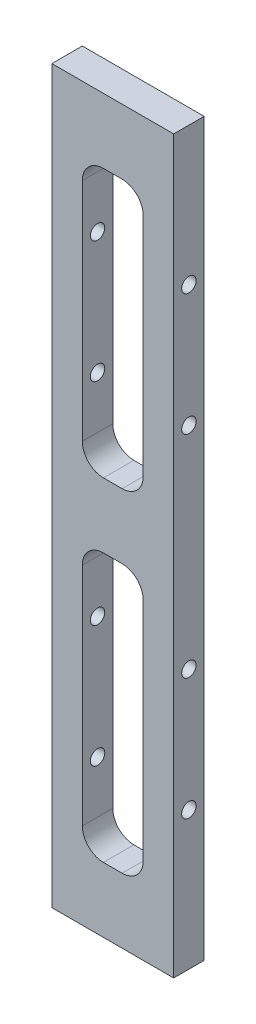
ISO-10303-21;
HEADER;
FILE_DESCRIPTION(('STEP AP214'),'2;1');
FILE_NAME('part.step','',(''),(''),'','','');
FILE_SCHEMA(('AUTOMOTIVE_DESIGN { 1 0 10303 214 1 1 1 1 }'));
ENDSEC;
DATA;
#1=APPLICATION_CONTEXT('core data for automotive mechanical design processes');
#2=APPLICATION_PROTOCOL_DEFINITION('international standard','automotive_design',2000,#1);
#3=PRODUCT_CONTEXT('',#1,'mechanical');
#4=PRODUCT('Part','Part','',(#3));
#5=PRODUCT_RELATED_PRODUCT_CATEGORY('part','',(#4));
#6=PRODUCT_DEFINITION_FORMATION('','',#4);
#7=PRODUCT_DEFINITION_CONTEXT('part definition',#1,'design');
#8=PRODUCT_DEFINITION('design','',#6,#7);
#9=PRODUCT_DEFINITION_SHAPE('','',#8);
#10=(LENGTH_UNIT() NAMED_UNIT(*) SI_UNIT(.MILLI.,.METRE.));
#11=(NAMED_UNIT(*) PLANE_ANGLE_UNIT() SI_UNIT($,.RADIAN.));
#12=(NAMED_UNIT(*) SI_UNIT($,.STERADIAN.) SOLID_ANGLE_UNIT());
#13=UNCERTAINTY_MEASURE_WITH_UNIT(LENGTH_MEASURE(1.E-05),#10,'distance_accuracy_value','');
#14=(GEOMETRIC_REPRESENTATION_CONTEXT(3) GLOBAL_UNCERTAINTY_ASSIGNED_CONTEXT((#13)) GLOBAL_UNIT_ASSIGNED_CONTEXT((#10,
#11,#12)) REPRESENTATION_CONTEXT('',''));
#15=CARTESIAN_POINT('',(0.,0.,0.));
#16=DIRECTION('',(0.,0.,1.));
#17=DIRECTION('',(1.,0.,0.));
#18=AXIS2_PLACEMENT_3D('',#15,#16,#17);
#19=CARTESIAN_POINT('',(9.525,-57.15,4.7625));
#20=DIRECTION('',(-1.,0.,0.));
#21=DIRECTION('',(0.,0.,1.));
#22=AXIS2_PLACEMENT_3D('',#19,#20,#21);
#23=PLANE('',#22);
#24=CARTESIAN_POINT('',(9.525,35.56,2.38125));
#25=DIRECTION('',(1.,0.,0.));
#26=DIRECTION('',(0.,0.,-1.));
#27=AXIS2_PLACEMENT_3D('',#24,#25,#26);
#28=CIRCLE('',#27,1.13029999999999);
#29=CARTESIAN_POINT('',(9.525,35.56,1.25095000000001));
#30=VERTEX_POINT('',#29);
#31=EDGE_CURVE('E516',#30,#30,#28,.T.);
#32=ORIENTED_EDGE('',*,*,#31,.F.);
#33=EDGE_LOOP('',(#32));
#34=FACE_BOUND('',#33,.T.);
#35=CARTESIAN_POINT('',(9.525,16.51,2.38125));
#36=DIRECTION('',(1.,0.,0.));
#37=DIRECTION('',(0.,0.,-1.));
#38=AXIS2_PLACEMENT_3D('',#35,#36,#37);
#39=CIRCLE('',#38,1.13029999999999);
#40=CARTESIAN_POINT('',(9.525,16.51,1.25095000000001));
#41=VERTEX_POINT('',#40);
#42=EDGE_CURVE('E290',#41,#41,#39,.T.);
#43=ORIENTED_EDGE('',*,*,#42,.F.);
#44=EDGE_LOOP('',(#43));
#45=FACE_BOUND('',#44,.T.);
#46=CARTESIAN_POINT('',(9.525,-16.51,2.38124999999999));
#47=DIRECTION('',(1.,0.,0.));
#48=DIRECTION('',(0.,0.,-1.));
#49=AXIS2_PLACEMENT_3D('',#46,#47,#48);
#50=CIRCLE('',#49,1.13029999999999);
#51=CARTESIAN_POINT('',(9.525,-16.51,1.25095));
#52=VERTEX_POINT('',#51);
#53=EDGE_CURVE('E287',#52,#52,#50,.T.);
#54=ORIENTED_EDGE('',*,*,#53,.F.);
#55=EDGE_LOOP('',(#54));
#56=FACE_BOUND('',#55,.T.);
#57=CARTESIAN_POINT('',(9.525,-35.56,2.38124999999999));
#58=DIRECTION('',(1.,0.,0.));
#59=DIRECTION('',(0.,0.,-1.));
#60=AXIS2_PLACEMENT_3D('',#57,#58,#59);
#61=CIRCLE('',#60,1.13029999999999);
#62=CARTESIAN_POINT('',(9.525,-35.56,1.25095));
#63=VERTEX_POINT('',#62);
#64=EDGE_CURVE('E305',#63,#63,#61,.T.);
#65=ORIENTED_EDGE('',*,*,#64,.F.);
#66=EDGE_LOOP('',(#65));
#67=FACE_BOUND('',#66,.T.);
#68=DIRECTION('',(0.,1.,0.));
#69=VECTOR('',#68,1.);
#70=CARTESIAN_POINT('',(9.525,-57.15,0.));
#71=LINE('',#70,#69);
#72=CARTESIAN_POINT('',(9.525,-57.15,0.));
#73=VERTEX_POINT('',#72);
#74=CARTESIAN_POINT('',(9.525,57.15,0.));
#75=VERTEX_POINT('',#74);
#76=EDGE_CURVE('E198',#73,#75,#71,.T.);
#77=ORIENTED_EDGE('',*,*,#76,.T.);
#78=DIRECTION('',(0.,0.,-1.));
#79=VECTOR('',#78,1.);
#80=CARTESIAN_POINT('',(9.525,57.15,4.7625));
#81=LINE('',#80,#79);
#82=CARTESIAN_POINT('',(9.525,57.15,4.7625));
#83=VERTEX_POINT('',#82);
#84=EDGE_CURVE('E179',#83,#75,#81,.T.);
#85=ORIENTED_EDGE('',*,*,#84,.F.);
#86=DIRECTION('',(0.,1.,0.));
#87=VECTOR('',#86,1.);
#88=CARTESIAN_POINT('',(9.525,-57.15,4.7625));
#89=LINE('',#88,#87);
#90=CARTESIAN_POINT('',(9.525,-57.15,4.7625));
#91=VERTEX_POINT('',#90);
#92=EDGE_CURVE('E186',#91,#83,#89,.T.);
#93=ORIENTED_EDGE('',*,*,#92,.F.);
#94=DIRECTION('',(0.,0.,-1.));
#95=VECTOR('',#94,1.);
#96=CARTESIAN_POINT('',(9.525,-57.15,4.7625));
#97=LINE('',#96,#95);
#98=EDGE_CURVE('E359',#91,#73,#97,.T.);
#99=ORIENTED_EDGE('',*,*,#98,.T.);
#100=EDGE_LOOP('',(#77,#85,#93,#99));
#101=FACE_BOUND('',#100,.T.);
#102=ADVANCED_FACE('F35',(#34,#45,#56,#67,#101),#23,.F.);
#103=CARTESIAN_POINT('',(-9.525,57.15,4.7625));
#104=DIRECTION('',(0.,-1.,0.));
#105=DIRECTION('',(0.,0.,-1.));
#106=AXIS2_PLACEMENT_3D('',#103,#104,#105);
#107=PLANE('',#106);
#108=DIRECTION('',(-1.,0.,0.));
#109=VECTOR('',#108,1.);
#110=CARTESIAN_POINT('',(-9.525,57.15,0.));
#111=LINE('',#110,#109);
#112=CARTESIAN_POINT('',(-9.525,57.15,0.));
#113=VERTEX_POINT('',#112);
#114=EDGE_CURVE('E361',#75,#113,#111,.T.);
#115=ORIENTED_EDGE('',*,*,#114,.T.);
#116=DIRECTION('',(0.,0.,-1.));
#117=VECTOR('',#116,1.);
#118=CARTESIAN_POINT('',(-9.525,57.15,4.7625));
#119=LINE('',#118,#117);
#120=CARTESIAN_POINT('',(-9.525,57.15,4.7625));
#121=VERTEX_POINT('',#120);
#122=EDGE_CURVE('E182',#121,#113,#119,.T.);
#123=ORIENTED_EDGE('',*,*,#122,.F.);
#124=DIRECTION('',(-1.,0.,0.));
#125=VECTOR('',#124,1.);
#126=CARTESIAN_POINT('',(-9.525,57.15,4.7625));
#127=LINE('',#126,#125);
#128=EDGE_CURVE('E175',#83,#121,#127,.T.);
#129=ORIENTED_EDGE('',*,*,#128,.F.);
#130=ORIENTED_EDGE('',*,*,#84,.T.);
#131=EDGE_LOOP('',(#115,#123,#129,#130));
#132=FACE_BOUND('',#131,.T.);
#133=ADVANCED_FACE('F177',(#132),#107,.F.);
#134=CARTESIAN_POINT('',(-9.525,-57.15,4.7625));
#135=DIRECTION('',(1.,0.,0.));
#136=DIRECTION('',(0.,0.,-1.));
#137=AXIS2_PLACEMENT_3D('',#134,#135,#136);
#138=PLANE('',#137);
#139=CARTESIAN_POINT('',(-9.525,35.56,2.38125));
#140=DIRECTION('',(1.,0.,0.));
#141=DIRECTION('',(0.,0.,-1.));
#142=AXIS2_PLACEMENT_3D('',#139,#140,#141);
#143=CIRCLE('',#142,1.13029999999999);
#144=CARTESIAN_POINT('',(-9.525,35.56,1.25095));
#145=VERTEX_POINT('',#144);
#146=EDGE_CURVE('E515',#145,#145,#143,.T.);
#147=ORIENTED_EDGE('',*,*,#146,.T.);
#148=EDGE_LOOP('',(#147));
#149=FACE_BOUND('',#148,.T.);
#150=CARTESIAN_POINT('',(-9.525,16.51,2.38125));
#151=DIRECTION('',(1.,0.,0.));
#152=DIRECTION('',(0.,0.,-1.));
#153=AXIS2_PLACEMENT_3D('',#150,#151,#152);
#154=CIRCLE('',#153,1.1303);
#155=CARTESIAN_POINT('',(-9.525,16.51,1.25095));
#156=VERTEX_POINT('',#155);
#157=EDGE_CURVE('E283',#156,#156,#154,.T.);
#158=ORIENTED_EDGE('',*,*,#157,.T.);
#159=EDGE_LOOP('',(#158));
#160=FACE_BOUND('',#159,.T.);
#161=CARTESIAN_POINT('',(-9.525,-16.51,2.38124999999999));
#162=DIRECTION('',(1.,0.,0.));
#163=DIRECTION('',(0.,0.,-1.));
#164=AXIS2_PLACEMENT_3D('',#161,#162,#163);
#165=CIRCLE('',#164,1.1303);
#166=CARTESIAN_POINT('',(-9.525,-16.51,1.25094999999999));
#167=VERTEX_POINT('',#166);
#168=EDGE_CURVE('E279',#167,#167,#165,.T.);
#169=ORIENTED_EDGE('',*,*,#168,.T.);
#170=EDGE_LOOP('',(#169));
#171=FACE_BOUND('',#170,.T.);
#172=CARTESIAN_POINT('',(-9.525,-35.56,2.38124999999999));
#173=DIRECTION('',(1.,0.,0.));
#174=DIRECTION('',(0.,0.,-1.));
#175=AXIS2_PLACEMENT_3D('',#172,#173,#174);
#176=CIRCLE('',#175,1.13029999999999);
#177=CARTESIAN_POINT('',(-9.525,-35.56,1.25095));
#178=VERTEX_POINT('',#177);
#179=EDGE_CURVE('E275',#178,#178,#176,.T.);
#180=ORIENTED_EDGE('',*,*,#179,.T.);
#181=EDGE_LOOP('',(#180));
#182=FACE_BOUND('',#181,.T.);
#183=DIRECTION('',(0.,-1.,0.));
#184=VECTOR('',#183,1.);
#185=CARTESIAN_POINT('',(-9.525,-57.15,0.));
#186=LINE('',#185,#184);
#187=CARTESIAN_POINT('',(-9.525,-57.15,0.));
#188=VERTEX_POINT('',#187);
#189=EDGE_CURVE('E363',#113,#188,#186,.T.);
#190=ORIENTED_EDGE('',*,*,#189,.T.);
#191=DIRECTION('',(0.,0.,-1.));
#192=VECTOR('',#191,1.);
#193=CARTESIAN_POINT('',(-9.525,-57.15,4.7625));
#194=LINE('',#193,#192);
#195=CARTESIAN_POINT('',(-9.525,-57.15,4.7625));
#196=VERTEX_POINT('',#195);
#197=EDGE_CURVE('E203',#196,#188,#194,.T.);
#198=ORIENTED_EDGE('',*,*,#197,.F.);
#199=DIRECTION('',(0.,-1.,0.));
#200=VECTOR('',#199,1.);
#201=CARTESIAN_POINT('',(-9.525,-57.15,4.7625));
#202=LINE('',#201,#200);
#203=EDGE_CURVE('E185',#121,#196,#202,.T.);
#204=ORIENTED_EDGE('',*,*,#203,.F.);
#205=ORIENTED_EDGE('',*,*,#122,.T.);
#206=EDGE_LOOP('',(#190,#198,#204,#205));
#207=FACE_BOUND('',#206,.T.);
#208=ADVANCED_FACE('F375',(#149,#160,#171,#182,#207),#138,.F.);
#209=CARTESIAN_POINT('',(-9.525,-57.15,4.7625));
#210=DIRECTION('',(0.,1.,0.));
#211=DIRECTION('',(0.,0.,1.));
#212=AXIS2_PLACEMENT_3D('',#209,#210,#211);
#213=PLANE('',#212);
#214=DIRECTION('',(1.,0.,0.));
#215=VECTOR('',#214,1.);
#216=CARTESIAN_POINT('',(-9.525,-57.15,0.));
#217=LINE('',#216,#215);
#218=EDGE_CURVE('E195',#188,#73,#217,.T.);
#219=ORIENTED_EDGE('',*,*,#218,.T.);
#220=ORIENTED_EDGE('',*,*,#98,.F.);
#221=DIRECTION('',(1.,0.,0.));
#222=VECTOR('',#221,1.);
#223=CARTESIAN_POINT('',(-9.525,-57.15,4.7625));
#224=LINE('',#223,#222);
#225=EDGE_CURVE('E191',#196,#91,#224,.T.);
#226=ORIENTED_EDGE('',*,*,#225,.F.);
#227=ORIENTED_EDGE('',*,*,#197,.T.);
#228=EDGE_LOOP('',(#219,#220,#226,#227));
#229=FACE_BOUND('',#228,.T.);
#230=ADVANCED_FACE('F370',(#229),#213,.F.);
#231=CARTESIAN_POINT('',(0.,0.,4.7625));
#232=DIRECTION('',(0.,0.,-1.));
#233=DIRECTION('',(-1.,0.,0.));
#234=AXIS2_PLACEMENT_3D('',#231,#232,#233);
#235=PLANE('',#234);
#236=DIRECTION('',(1.,0.,0.));
#237=VECTOR('',#236,1.);
#238=CARTESIAN_POINT('',(-4.7625,-46.99,4.7625));
#239=LINE('',#238,#237);
#240=CARTESIAN_POINT('',(-1.4605,-46.99,4.7625));
#241=VERTEX_POINT('',#240);
#242=CARTESIAN_POINT('',(1.4605,-46.99,4.7625));
#243=VERTEX_POINT('',#242);
#244=EDGE_CURVE('E329',#241,#243,#239,.T.);
#245=ORIENTED_EDGE('',*,*,#244,.F.);
#246=CARTESIAN_POINT('',(-1.4605,-43.688,4.7625));
#247=DIRECTION('',(0.,0.,-1.));
#248=DIRECTION('',(-1.,0.,0.));
#249=AXIS2_PLACEMENT_3D('',#246,#247,#248);
#250=CIRCLE('',#249,3.302);
#251=CARTESIAN_POINT('',(-4.7625,-43.688,4.7625));
#252=VERTEX_POINT('',#251);
#253=EDGE_CURVE('E243',#241,#252,#250,.T.);
#254=ORIENTED_EDGE('',*,*,#253,.T.);
#255=DIRECTION('',(0.,-1.,0.));
#256=VECTOR('',#255,1.);
#257=CARTESIAN_POINT('',(-4.7625,-5.08,4.7625));
#258=LINE('',#257,#256);
#259=CARTESIAN_POINT('',(-4.7625,-8.382,4.7625));
#260=VERTEX_POINT('',#259);
#261=EDGE_CURVE('E312',#260,#252,#258,.T.);
#262=ORIENTED_EDGE('',*,*,#261,.F.);
#263=CARTESIAN_POINT('',(-1.4605,-8.382,4.7625));
#264=DIRECTION('',(0.,0.,-1.));
#265=DIRECTION('',(-1.,0.,0.));
#266=AXIS2_PLACEMENT_3D('',#263,#264,#265);
#267=CIRCLE('',#266,3.302);
#268=CARTESIAN_POINT('',(-1.4605,-5.08,4.7625));
#269=VERTEX_POINT('',#268);
#270=EDGE_CURVE('E251',#260,#269,#267,.T.);
#271=ORIENTED_EDGE('',*,*,#270,.T.);
#272=DIRECTION('',(-1.,0.,0.));
#273=VECTOR('',#272,1.);
#274=CARTESIAN_POINT('',(-4.7625,-5.08,4.7625));
#275=LINE('',#274,#273);
#276=CARTESIAN_POINT('',(1.4605,-5.08,4.7625));
#277=VERTEX_POINT('',#276);
#278=EDGE_CURVE('E317',#277,#269,#275,.T.);
#279=ORIENTED_EDGE('',*,*,#278,.F.);
#280=CARTESIAN_POINT('',(1.4605,-8.382,4.7625));
#281=DIRECTION('',(0.,0.,-1.));
#282=DIRECTION('',(-1.,0.,0.));
#283=AXIS2_PLACEMENT_3D('',#280,#281,#282);
#284=CIRCLE('',#283,3.302);
#285=CARTESIAN_POINT('',(4.7625,-8.382,4.7625));
#286=VERTEX_POINT('',#285);
#287=EDGE_CURVE('E255',#277,#286,#284,.T.);
#288=ORIENTED_EDGE('',*,*,#287,.T.);
#289=DIRECTION('',(0.,1.,0.));
#290=VECTOR('',#289,1.);
#291=CARTESIAN_POINT('',(4.7625,-5.08,4.7625));
#292=LINE('',#291,#290);
#293=CARTESIAN_POINT('',(4.7625,-43.688,4.7625));
#294=VERTEX_POINT('',#293);
#295=EDGE_CURVE('E332',#294,#286,#292,.T.);
#296=ORIENTED_EDGE('',*,*,#295,.F.);
#297=CARTESIAN_POINT('',(1.4605,-43.688,4.7625));
#298=DIRECTION('',(0.,0.,-1.));
#299=DIRECTION('',(-1.,0.,0.));
#300=AXIS2_PLACEMENT_3D('',#297,#298,#299);
#301=CIRCLE('',#300,3.302);
#302=EDGE_CURVE('E247',#294,#243,#301,.T.);
#303=ORIENTED_EDGE('',*,*,#302,.T.);
#304=EDGE_LOOP('',(#245,#254,#262,#271,#279,#288,#296,#303));
#305=FACE_BOUND('',#304,.T.);
#306=DIRECTION('',(-1.,0.,0.));
#307=VECTOR('',#306,1.);
#308=CARTESIAN_POINT('',(-4.7625,46.99,4.7625));
#309=LINE('',#308,#307);
#310=CARTESIAN_POINT('',(1.4605,46.99,4.7625));
#311=VERTEX_POINT('',#310);
#312=CARTESIAN_POINT('',(-1.4605,46.99,4.7625));
#313=VERTEX_POINT('',#312);
#314=EDGE_CURVE('E350',#311,#313,#309,.T.);
#315=ORIENTED_EDGE('',*,*,#314,.F.);
#316=CARTESIAN_POINT('',(1.4605,43.688,4.7625));
#317=DIRECTION('',(0.,0.,-1.));
#318=DIRECTION('',(-1.,0.,0.));
#319=AXIS2_PLACEMENT_3D('',#316,#317,#318);
#320=CIRCLE('',#319,3.302);
#321=CARTESIAN_POINT('',(4.7625,43.688,4.7625));
#322=VERTEX_POINT('',#321);
#323=EDGE_CURVE('E267',#311,#322,#320,.T.);
#324=ORIENTED_EDGE('',*,*,#323,.T.);
#325=DIRECTION('',(0.,1.,0.));
#326=VECTOR('',#325,1.);
#327=CARTESIAN_POINT('',(4.7625,5.08,4.7625));
#328=LINE('',#327,#326);
#329=CARTESIAN_POINT('',(4.7625,8.382,4.7625));
#330=VERTEX_POINT('',#329);
#331=EDGE_CURVE('E326',#330,#322,#328,.T.);
#332=ORIENTED_EDGE('',*,*,#331,.F.);
#333=CARTESIAN_POINT('',(1.4605,8.382,4.7625));
#334=DIRECTION('',(0.,0.,-1.));
#335=DIRECTION('',(-1.,0.,0.));
#336=AXIS2_PLACEMENT_3D('',#333,#334,#335);
#337=CIRCLE('',#336,3.302);
#338=CARTESIAN_POINT('',(1.4605,5.08,4.7625));
#339=VERTEX_POINT('',#338);
#340=EDGE_CURVE('E263',#330,#339,#337,.T.);
#341=ORIENTED_EDGE('',*,*,#340,.T.);
#342=DIRECTION('',(1.,0.,0.));
#343=VECTOR('',#342,1.);
#344=CARTESIAN_POINT('',(-4.7625,5.08,4.7625));
#345=LINE('',#344,#343);
#346=CARTESIAN_POINT('',(-1.4605,5.08,4.7625));
#347=VERTEX_POINT('',#346);
#348=EDGE_CURVE('E340',#347,#339,#345,.T.);
#349=ORIENTED_EDGE('',*,*,#348,.F.);
#350=CARTESIAN_POINT('',(-1.4605,8.382,4.7625));
#351=DIRECTION('',(0.,0.,-1.));
#352=DIRECTION('',(-1.,0.,0.));
#353=AXIS2_PLACEMENT_3D('',#350,#351,#352);
#354=CIRCLE('',#353,3.302);
#355=CARTESIAN_POINT('',(-4.7625,8.382,4.7625));
#356=VERTEX_POINT('',#355);
#357=EDGE_CURVE('E259',#347,#356,#354,.T.);
#358=ORIENTED_EDGE('',*,*,#357,.T.);
#359=DIRECTION('',(0.,-1.,0.));
#360=VECTOR('',#359,1.);
#361=CARTESIAN_POINT('',(-4.7625,5.08,4.7625));
#362=LINE('',#361,#360);
#363=CARTESIAN_POINT('',(-4.7625,43.688,4.7625));
#364=VERTEX_POINT('',#363);
#365=EDGE_CURVE('E352',#364,#356,#362,.T.);
#366=ORIENTED_EDGE('',*,*,#365,.F.);
#367=CARTESIAN_POINT('',(-1.4605,43.688,4.7625));
#368=DIRECTION('',(0.,0.,-1.));
#369=DIRECTION('',(-1.,0.,0.));
#370=AXIS2_PLACEMENT_3D('',#367,#368,#369);
#371=CIRCLE('',#370,3.302);
#372=EDGE_CURVE('E44',#364,#313,#371,.T.);
#373=ORIENTED_EDGE('',*,*,#372,.T.);
#374=EDGE_LOOP('',(#315,#324,#332,#341,#349,#358,#366,#373));
#375=FACE_BOUND('',#374,.T.);
#376=ORIENTED_EDGE('',*,*,#92,.T.);
#377=ORIENTED_EDGE('',*,*,#128,.T.);
#378=ORIENTED_EDGE('',*,*,#203,.T.);
#379=ORIENTED_EDGE('',*,*,#225,.T.);
#380=EDGE_LOOP('',(#376,#377,#378,#379));
#381=FACE_BOUND('',#380,.T.);
#382=ADVANCED_FACE('F189',(#305,#375,#381),#235,.F.);
#383=CARTESIAN_POINT('',(0.,0.,0.));
#384=DIRECTION('',(0.,0.,-1.));
#385=DIRECTION('',(-1.,0.,0.));
#386=AXIS2_PLACEMENT_3D('',#383,#384,#385);
#387=PLANE('',#386);
#388=DIRECTION('',(-1.,0.,0.));
#389=VECTOR('',#388,1.);
#390=CARTESIAN_POINT('',(-4.7625,-5.08,0.));
#391=LINE('',#390,#389);
#392=CARTESIAN_POINT('',(1.4605,-5.08,0.));
#393=VERTEX_POINT('',#392);
#394=CARTESIAN_POINT('',(-1.4605,-5.08,0.));
#395=VERTEX_POINT('',#394);
#396=EDGE_CURVE('E323',#393,#395,#391,.T.);
#397=ORIENTED_EDGE('',*,*,#396,.T.);
#398=CARTESIAN_POINT('',(-1.4605,-8.382,0.));
#399=DIRECTION('',(0.,0.,-1.));
#400=DIRECTION('',(-1.,0.,0.));
#401=AXIS2_PLACEMENT_3D('',#398,#399,#400);
#402=CIRCLE('',#401,3.302);
#403=CARTESIAN_POINT('',(-4.7625,-8.382,0.));
#404=VERTEX_POINT('',#403);
#405=EDGE_CURVE('E253',#395,#404,#402,.F.);
#406=ORIENTED_EDGE('',*,*,#405,.T.);
#407=DIRECTION('',(0.,-1.,0.));
#408=VECTOR('',#407,1.);
#409=CARTESIAN_POINT('',(-4.7625,-5.08,0.));
#410=LINE('',#409,#408);
#411=CARTESIAN_POINT('',(-4.7625,-43.688,0.));
#412=VERTEX_POINT('',#411);
#413=EDGE_CURVE('E313',#404,#412,#410,.T.);
#414=ORIENTED_EDGE('',*,*,#413,.T.);
#415=CARTESIAN_POINT('',(-1.4605,-43.688,0.));
#416=DIRECTION('',(0.,0.,-1.));
#417=DIRECTION('',(-1.,0.,0.));
#418=AXIS2_PLACEMENT_3D('',#415,#416,#417);
#419=CIRCLE('',#418,3.302);
#420=CARTESIAN_POINT('',(-1.4605,-46.99,0.));
#421=VERTEX_POINT('',#420);
#422=EDGE_CURVE('E245',#412,#421,#419,.F.);
#423=ORIENTED_EDGE('',*,*,#422,.T.);
#424=DIRECTION('',(1.,0.,0.));
#425=VECTOR('',#424,1.);
#426=CARTESIAN_POINT('',(-4.7625,-46.99,0.));
#427=LINE('',#426,#425);
#428=CARTESIAN_POINT('',(1.4605,-46.99,0.));
#429=VERTEX_POINT('',#428);
#430=EDGE_CURVE('E316',#421,#429,#427,.T.);
#431=ORIENTED_EDGE('',*,*,#430,.T.);
#432=CARTESIAN_POINT('',(1.4605,-43.688,0.));
#433=DIRECTION('',(0.,0.,-1.));
#434=DIRECTION('',(-1.,0.,0.));
#435=AXIS2_PLACEMENT_3D('',#432,#433,#434);
#436=CIRCLE('',#435,3.302);
#437=CARTESIAN_POINT('',(4.7625,-43.688,0.));
#438=VERTEX_POINT('',#437);
#439=EDGE_CURVE('E249',#429,#438,#436,.F.);
#440=ORIENTED_EDGE('',*,*,#439,.T.);
#441=DIRECTION('',(0.,1.,0.));
#442=VECTOR('',#441,1.);
#443=CARTESIAN_POINT('',(4.7625,-5.08,0.));
#444=LINE('',#443,#442);
#445=CARTESIAN_POINT('',(4.7625,-8.382,0.));
#446=VERTEX_POINT('',#445);
#447=EDGE_CURVE('E320',#438,#446,#444,.T.);
#448=ORIENTED_EDGE('',*,*,#447,.T.);
#449=CARTESIAN_POINT('',(1.4605,-8.382,0.));
#450=DIRECTION('',(0.,0.,-1.));
#451=DIRECTION('',(-1.,0.,0.));
#452=AXIS2_PLACEMENT_3D('',#449,#450,#451);
#453=CIRCLE('',#452,3.302);
#454=EDGE_CURVE('E257',#446,#393,#453,.F.);
#455=ORIENTED_EDGE('',*,*,#454,.T.);
#456=EDGE_LOOP('',(#397,#406,#414,#423,#431,#440,#448,#455));
#457=FACE_BOUND('',#456,.T.);
#458=DIRECTION('',(1.,0.,0.));
#459=VECTOR('',#458,1.);
#460=CARTESIAN_POINT('',(-4.7625,5.08,0.));
#461=LINE('',#460,#459);
#462=CARTESIAN_POINT('',(-1.4605,5.08,0.));
#463=VERTEX_POINT('',#462);
#464=CARTESIAN_POINT('',(1.4605,5.08,0.));
#465=VERTEX_POINT('',#464);
#466=EDGE_CURVE('E345',#463,#465,#461,.T.);
#467=ORIENTED_EDGE('',*,*,#466,.T.);
#468=CARTESIAN_POINT('',(1.4605,8.382,0.));
#469=DIRECTION('',(0.,0.,-1.));
#470=DIRECTION('',(-1.,0.,0.));
#471=AXIS2_PLACEMENT_3D('',#468,#469,#470);
#472=CIRCLE('',#471,3.302);
#473=CARTESIAN_POINT('',(4.7625,8.382,0.));
#474=VERTEX_POINT('',#473);
#475=EDGE_CURVE('E265',#465,#474,#472,.F.);
#476=ORIENTED_EDGE('',*,*,#475,.T.);
#477=DIRECTION('',(0.,1.,0.));
#478=VECTOR('',#477,1.);
#479=CARTESIAN_POINT('',(4.7625,5.08,0.));
#480=LINE('',#479,#478);
#481=CARTESIAN_POINT('',(4.7625,43.688,0.));
#482=VERTEX_POINT('',#481);
#483=EDGE_CURVE('E337',#474,#482,#480,.T.);
#484=ORIENTED_EDGE('',*,*,#483,.T.);
#485=CARTESIAN_POINT('',(1.4605,43.688,0.));
#486=DIRECTION('',(0.,0.,-1.));
#487=DIRECTION('',(-1.,0.,0.));
#488=AXIS2_PLACEMENT_3D('',#485,#486,#487);
#489=CIRCLE('',#488,3.302);
#490=CARTESIAN_POINT('',(1.4605,46.99,0.));
#491=VERTEX_POINT('',#490);
#492=EDGE_CURVE('E59',#482,#491,#489,.F.);
#493=ORIENTED_EDGE('',*,*,#492,.T.);
#494=DIRECTION('',(-1.,0.,0.));
#495=VECTOR('',#494,1.);
#496=CARTESIAN_POINT('',(-4.7625,46.99,0.));
#497=LINE('',#496,#495);
#498=CARTESIAN_POINT('',(-1.4605,46.99,0.));
#499=VERTEX_POINT('',#498);
#500=EDGE_CURVE('E339',#491,#499,#497,.T.);
#501=ORIENTED_EDGE('',*,*,#500,.T.);
#502=CARTESIAN_POINT('',(-1.4605,43.688,0.));
#503=DIRECTION('',(0.,0.,-1.));
#504=DIRECTION('',(-1.,0.,0.));
#505=AXIS2_PLACEMENT_3D('',#502,#503,#504);
#506=CIRCLE('',#505,3.302);
#507=CARTESIAN_POINT('',(-4.7625,43.688,0.));
#508=VERTEX_POINT('',#507);
#509=EDGE_CURVE('E11',#499,#508,#506,.F.);
#510=ORIENTED_EDGE('',*,*,#509,.T.);
#511=DIRECTION('',(0.,-1.,0.));
#512=VECTOR('',#511,1.);
#513=CARTESIAN_POINT('',(-4.7625,5.08,0.));
#514=LINE('',#513,#512);
#515=CARTESIAN_POINT('',(-4.7625,8.382,0.));
#516=VERTEX_POINT('',#515);
#517=EDGE_CURVE('E342',#508,#516,#514,.T.);
#518=ORIENTED_EDGE('',*,*,#517,.T.);
#519=CARTESIAN_POINT('',(-1.4605,8.382,0.));
#520=DIRECTION('',(0.,0.,-1.));
#521=DIRECTION('',(-1.,0.,0.));
#522=AXIS2_PLACEMENT_3D('',#519,#520,#521);
#523=CIRCLE('',#522,3.302);
#524=EDGE_CURVE('E261',#516,#463,#523,.F.);
#525=ORIENTED_EDGE('',*,*,#524,.T.);
#526=EDGE_LOOP('',(#467,#476,#484,#493,#501,#510,#518,#525));
#527=FACE_BOUND('',#526,.T.);
#528=ORIENTED_EDGE('',*,*,#76,.F.);
#529=ORIENTED_EDGE('',*,*,#218,.F.);
#530=ORIENTED_EDGE('',*,*,#189,.F.);
#531=ORIENTED_EDGE('',*,*,#114,.F.);
#532=EDGE_LOOP('',(#528,#529,#530,#531));
#533=FACE_BOUND('',#532,.T.);
#534=ADVANCED_FACE('F374',(#457,#527,#533),#387,.T.);
#535=CARTESIAN_POINT('',(4.7625,5.08,0.));
#536=DIRECTION('',(1.,0.,0.));
#537=DIRECTION('',(0.,0.,-1.));
#538=AXIS2_PLACEMENT_3D('',#535,#536,#537);
#539=PLANE('',#538);
#540=CARTESIAN_POINT('',(4.7625,35.56,2.38125));
#541=DIRECTION('',(1.,0.,0.));
#542=DIRECTION('',(0.,0.,-1.));
#543=AXIS2_PLACEMENT_3D('',#540,#541,#542);
#544=CIRCLE('',#543,1.13029999999999);
#545=CARTESIAN_POINT('',(4.7625,35.56,1.25095000000001));
#546=VERTEX_POINT('',#545);
#547=EDGE_CURVE('E295',#546,#546,#544,.T.);
#548=ORIENTED_EDGE('',*,*,#547,.T.);
#549=EDGE_LOOP('',(#548));
#550=FACE_BOUND('',#549,.T.);
#551=CARTESIAN_POINT('',(4.7625,16.51,2.38125));
#552=DIRECTION('',(1.,0.,0.));
#553=DIRECTION('',(0.,0.,-1.));
#554=AXIS2_PLACEMENT_3D('',#551,#552,#553);
#555=CIRCLE('',#554,1.13029999999999);
#556=CARTESIAN_POINT('',(4.7625,16.51,1.25095));
#557=VERTEX_POINT('',#556);
#558=EDGE_CURVE('E282',#557,#557,#555,.T.);
#559=ORIENTED_EDGE('',*,*,#558,.T.);
#560=EDGE_LOOP('',(#559));
#561=FACE_BOUND('',#560,.T.);
#562=ORIENTED_EDGE('',*,*,#483,.F.);
#563=DIRECTION('',(0.,0.,1.));
#564=VECTOR('',#563,1.);
#565=CARTESIAN_POINT('',(4.7625,8.382,4.7625));
#566=LINE('',#565,#564);
#567=EDGE_CURVE('E236',#474,#330,#566,.T.);
#568=ORIENTED_EDGE('',*,*,#567,.T.);
#569=ORIENTED_EDGE('',*,*,#331,.T.);
#570=DIRECTION('',(0.,0.,1.));
#571=VECTOR('',#570,1.);
#572=CARTESIAN_POINT('',(4.7625,43.688,0.));
#573=LINE('',#572,#571);
#574=EDGE_CURVE('E234',#322,#482,#573,.F.);
#575=ORIENTED_EDGE('',*,*,#574,.T.);
#576=EDGE_LOOP('',(#562,#568,#569,#575));
#577=FACE_BOUND('',#576,.T.);
#578=ADVANCED_FACE('F450',(#550,#561,#577),#539,.F.);
#579=CARTESIAN_POINT('',(-4.7625,5.08,0.));
#580=DIRECTION('',(0.,-1.,0.));
#581=DIRECTION('',(0.,0.,-1.));
#582=AXIS2_PLACEMENT_3D('',#579,#580,#581);
#583=PLANE('',#582);
#584=ORIENTED_EDGE('',*,*,#466,.F.);
#585=DIRECTION('',(0.,0.,1.));
#586=VECTOR('',#585,1.);
#587=CARTESIAN_POINT('',(-1.4605,5.08,4.7625));
#588=LINE('',#587,#586);
#589=EDGE_CURVE('E226',#463,#347,#588,.T.);
#590=ORIENTED_EDGE('',*,*,#589,.T.);
#591=ORIENTED_EDGE('',*,*,#348,.T.);
#592=DIRECTION('',(0.,0.,1.));
#593=VECTOR('',#592,1.);
#594=CARTESIAN_POINT('',(1.4605,5.08,0.));
#595=LINE('',#594,#593);
#596=EDGE_CURVE('E224',#339,#465,#595,.F.);
#597=ORIENTED_EDGE('',*,*,#596,.T.);
#598=EDGE_LOOP('',(#584,#590,#591,#597));
#599=FACE_BOUND('',#598,.T.);
#600=ADVANCED_FACE('F444',(#599),#583,.F.);
#601=CARTESIAN_POINT('',(-4.7625,5.08,0.));
#602=DIRECTION('',(-1.,0.,0.));
#603=DIRECTION('',(0.,0.,1.));
#604=AXIS2_PLACEMENT_3D('',#601,#602,#603);
#605=PLANE('',#604);
#606=CARTESIAN_POINT('',(-4.7625,35.56,2.38125));
#607=DIRECTION('',(-1.,0.,0.));
#608=DIRECTION('',(0.,0.,1.));
#609=AXIS2_PLACEMENT_3D('',#606,#607,#608);
#610=CIRCLE('',#609,1.13029999999999);
#611=CARTESIAN_POINT('',(-4.7625,35.56,3.51154999999999));
#612=VERTEX_POINT('',#611);
#613=EDGE_CURVE('E39',#612,#612,#610,.T.);
#614=ORIENTED_EDGE('',*,*,#613,.T.);
#615=EDGE_LOOP('',(#614));
#616=FACE_BOUND('',#615,.T.);
#617=CARTESIAN_POINT('',(-4.7625,16.51,2.38125));
#618=DIRECTION('',(-1.,0.,0.));
#619=DIRECTION('',(0.,0.,1.));
#620=AXIS2_PLACEMENT_3D('',#617,#618,#619);
#621=CIRCLE('',#620,1.13029999999999);
#622=CARTESIAN_POINT('',(-4.7625,16.51,3.51154999999999));
#623=VERTEX_POINT('',#622);
#624=EDGE_CURVE('E280',#623,#623,#621,.T.);
#625=ORIENTED_EDGE('',*,*,#624,.T.);
#626=EDGE_LOOP('',(#625));
#627=FACE_BOUND('',#626,.T.);
#628=ORIENTED_EDGE('',*,*,#365,.T.);
#629=DIRECTION('',(0.,0.,1.));
#630=VECTOR('',#629,1.);
#631=CARTESIAN_POINT('',(-4.7625,8.382,0.));
#632=LINE('',#631,#630);
#633=EDGE_CURVE('E232',#356,#516,#632,.F.);
#634=ORIENTED_EDGE('',*,*,#633,.T.);
#635=ORIENTED_EDGE('',*,*,#517,.F.);
#636=DIRECTION('',(0.,0.,1.));
#637=VECTOR('',#636,1.);
#638=CARTESIAN_POINT('',(-4.7625,43.688,4.7625));
#639=LINE('',#638,#637);
#640=EDGE_CURVE('E229',#508,#364,#639,.T.);
#641=ORIENTED_EDGE('',*,*,#640,.T.);
#642=EDGE_LOOP('',(#628,#634,#635,#641));
#643=FACE_BOUND('',#642,.T.);
#644=ADVANCED_FACE('F437',(#616,#627,#643),#605,.F.);
#645=CARTESIAN_POINT('',(-4.7625,46.99,0.));
#646=DIRECTION('',(0.,1.,0.));
#647=DIRECTION('',(0.,0.,1.));
#648=AXIS2_PLACEMENT_3D('',#645,#646,#647);
#649=PLANE('',#648);
#650=ORIENTED_EDGE('',*,*,#500,.F.);
#651=DIRECTION('',(0.,0.,1.));
#652=VECTOR('',#651,1.);
#653=CARTESIAN_POINT('',(1.4605,46.99,4.7625));
#654=LINE('',#653,#652);
#655=EDGE_CURVE('E240',#491,#311,#654,.T.);
#656=ORIENTED_EDGE('',*,*,#655,.T.);
#657=ORIENTED_EDGE('',*,*,#314,.T.);
#658=DIRECTION('',(0.,0.,1.));
#659=VECTOR('',#658,1.);
#660=CARTESIAN_POINT('',(-1.4605,46.99,0.));
#661=LINE('',#660,#659);
#662=EDGE_CURVE('E52',#313,#499,#661,.F.);
#663=ORIENTED_EDGE('',*,*,#662,.T.);
#664=EDGE_LOOP('',(#650,#656,#657,#663));
#665=FACE_BOUND('',#664,.T.);
#666=ADVANCED_FACE('F429',(#665),#649,.F.);
#667=CARTESIAN_POINT('',(-4.7625,-5.08,0.));
#668=DIRECTION('',(-1.,0.,0.));
#669=DIRECTION('',(0.,0.,1.));
#670=AXIS2_PLACEMENT_3D('',#667,#668,#669);
#671=PLANE('',#670);
#672=CARTESIAN_POINT('',(-4.7625,-16.51,2.38124999999999));
#673=DIRECTION('',(-1.,0.,0.));
#674=DIRECTION('',(0.,0.,1.));
#675=AXIS2_PLACEMENT_3D('',#672,#673,#674);
#676=CIRCLE('',#675,1.13029999999999);
#677=CARTESIAN_POINT('',(-4.7625,-16.51,3.51154999999998));
#678=VERTEX_POINT('',#677);
#679=EDGE_CURVE('E278',#678,#678,#676,.T.);
#680=ORIENTED_EDGE('',*,*,#679,.T.);
#681=EDGE_LOOP('',(#680));
#682=FACE_BOUND('',#681,.T.);
#683=CARTESIAN_POINT('',(-4.7625,-35.56,2.38124999999999));
#684=DIRECTION('',(-1.,0.,0.));
#685=DIRECTION('',(0.,0.,1.));
#686=AXIS2_PLACEMENT_3D('',#683,#684,#685);
#687=CIRCLE('',#686,1.13029999999999);
#688=CARTESIAN_POINT('',(-4.7625,-35.56,3.51154999999998));
#689=VERTEX_POINT('',#688);
#690=EDGE_CURVE('E271',#689,#689,#687,.T.);
#691=ORIENTED_EDGE('',*,*,#690,.T.);
#692=EDGE_LOOP('',(#691));
#693=FACE_BOUND('',#692,.T.);
#694=ORIENTED_EDGE('',*,*,#261,.T.);
#695=DIRECTION('',(0.,0.,1.));
#696=VECTOR('',#695,1.);
#697=CARTESIAN_POINT('',(-4.7625,-43.688,0.));
#698=LINE('',#697,#696);
#699=EDGE_CURVE('E212',#252,#412,#698,.F.);
#700=ORIENTED_EDGE('',*,*,#699,.T.);
#701=ORIENTED_EDGE('',*,*,#413,.F.);
#702=DIRECTION('',(0.,0.,1.));
#703=VECTOR('',#702,1.);
#704=CARTESIAN_POINT('',(-4.7625,-8.382,4.7625));
#705=LINE('',#704,#703);
#706=EDGE_CURVE('E209',#404,#260,#705,.T.);
#707=ORIENTED_EDGE('',*,*,#706,.T.);
#708=EDGE_LOOP('',(#694,#700,#701,#707));
#709=FACE_BOUND('',#708,.T.);
#710=ADVANCED_FACE('F495',(#682,#693,#709),#671,.F.);
#711=CARTESIAN_POINT('',(-4.7625,-5.08,0.));
#712=DIRECTION('',(0.,1.,0.));
#713=DIRECTION('',(0.,0.,1.));
#714=AXIS2_PLACEMENT_3D('',#711,#712,#713);
#715=PLANE('',#714);
#716=ORIENTED_EDGE('',*,*,#278,.T.);
#717=DIRECTION('',(0.,0.,1.));
#718=VECTOR('',#717,1.);
#719=CARTESIAN_POINT('',(-1.4605,-5.08,0.));
#720=LINE('',#719,#718);
#721=EDGE_CURVE('E222',#269,#395,#720,.F.);
#722=ORIENTED_EDGE('',*,*,#721,.T.);
#723=ORIENTED_EDGE('',*,*,#396,.F.);
#724=DIRECTION('',(0.,0.,1.));
#725=VECTOR('',#724,1.);
#726=CARTESIAN_POINT('',(1.4605,-5.08,4.7625));
#727=LINE('',#726,#725);
#728=EDGE_CURVE('E219',#393,#277,#727,.T.);
#729=ORIENTED_EDGE('',*,*,#728,.T.);
#730=EDGE_LOOP('',(#716,#722,#723,#729));
#731=FACE_BOUND('',#730,.T.);
#732=ADVANCED_FACE('F488',(#731),#715,.F.);
#733=CARTESIAN_POINT('',(4.7625,-5.08,0.));
#734=DIRECTION('',(1.,0.,0.));
#735=DIRECTION('',(0.,0.,-1.));
#736=AXIS2_PLACEMENT_3D('',#733,#734,#735);
#737=PLANE('',#736);
#738=CARTESIAN_POINT('',(4.7625,-16.51,2.38124999999999));
#739=DIRECTION('',(1.,0.,0.));
#740=DIRECTION('',(0.,0.,-1.));
#741=AXIS2_PLACEMENT_3D('',#738,#739,#740);
#742=CIRCLE('',#741,1.13029999999999);
#743=CARTESIAN_POINT('',(4.7625,-16.51,1.25095));
#744=VERTEX_POINT('',#743);
#745=EDGE_CURVE('E276',#744,#744,#742,.T.);
#746=ORIENTED_EDGE('',*,*,#745,.T.);
#747=EDGE_LOOP('',(#746));
#748=FACE_BOUND('',#747,.T.);
#749=CARTESIAN_POINT('',(4.7625,-35.56,2.38124999999999));
#750=DIRECTION('',(1.,0.,0.));
#751=DIRECTION('',(0.,0.,-1.));
#752=AXIS2_PLACEMENT_3D('',#749,#750,#751);
#753=CIRCLE('',#752,1.13029999999999);
#754=CARTESIAN_POINT('',(4.7625,-35.56,1.25095));
#755=VERTEX_POINT('',#754);
#756=EDGE_CURVE('E274',#755,#755,#753,.T.);
#757=ORIENTED_EDGE('',*,*,#756,.T.);
#758=EDGE_LOOP('',(#757));
#759=FACE_BOUND('',#758,.T.);
#760=ORIENTED_EDGE('',*,*,#447,.F.);
#761=DIRECTION('',(0.,0.,1.));
#762=VECTOR('',#761,1.);
#763=CARTESIAN_POINT('',(4.7625,-43.688,4.7625));
#764=LINE('',#763,#762);
#765=EDGE_CURVE('E216',#438,#294,#764,.T.);
#766=ORIENTED_EDGE('',*,*,#765,.T.);
#767=ORIENTED_EDGE('',*,*,#295,.T.);
#768=DIRECTION('',(0.,0.,1.));
#769=VECTOR('',#768,1.);
#770=CARTESIAN_POINT('',(4.7625,-8.382,0.));
#771=LINE('',#770,#769);
#772=EDGE_CURVE('E214',#286,#446,#771,.F.);
#773=ORIENTED_EDGE('',*,*,#772,.T.);
#774=EDGE_LOOP('',(#760,#766,#767,#773));
#775=FACE_BOUND('',#774,.T.);
#776=ADVANCED_FACE('F482',(#748,#759,#775),#737,.F.);
#777=CARTESIAN_POINT('',(-4.7625,-46.99,0.));
#778=DIRECTION('',(0.,-1.,0.));
#779=DIRECTION('',(0.,0.,-1.));
#780=AXIS2_PLACEMENT_3D('',#777,#778,#779);
#781=PLANE('',#780);
#782=ORIENTED_EDGE('',*,*,#430,.F.);
#783=DIRECTION('',(0.,0.,1.));
#784=VECTOR('',#783,1.);
#785=CARTESIAN_POINT('',(-1.4605,-46.99,4.7625));
#786=LINE('',#785,#784);
#787=EDGE_CURVE('E201',#421,#241,#786,.T.);
#788=ORIENTED_EDGE('',*,*,#787,.T.);
#789=ORIENTED_EDGE('',*,*,#244,.T.);
#790=DIRECTION('',(0.,0.,1.));
#791=VECTOR('',#790,1.);
#792=CARTESIAN_POINT('',(1.4605,-46.99,0.));
#793=LINE('',#792,#791);
#794=EDGE_CURVE('E199',#243,#429,#793,.F.);
#795=ORIENTED_EDGE('',*,*,#794,.T.);
#796=EDGE_LOOP('',(#782,#788,#789,#795));
#797=FACE_BOUND('',#796,.T.);
#798=ADVANCED_FACE('F398',(#797),#781,.F.);
#799=CARTESIAN_POINT('',(-1.4605,-43.688,0.));
#800=DIRECTION('',(0.,0.,-1.));
#801=DIRECTION('',(-1.,0.,0.));
#802=AXIS2_PLACEMENT_3D('',#799,#800,#801);
#803=CYLINDRICAL_SURFACE('',#802,3.302);
#804=ORIENTED_EDGE('',*,*,#422,.F.);
#805=ORIENTED_EDGE('',*,*,#699,.F.);
#806=ORIENTED_EDGE('',*,*,#253,.F.);
#807=ORIENTED_EDGE('',*,*,#787,.F.);
#808=EDGE_LOOP('',(#804,#805,#806,#807));
#809=FACE_BOUND('',#808,.T.);
#810=ADVANCED_FACE('F394',(#809),#803,.F.);
#811=CARTESIAN_POINT('',(1.4605,-43.688,0.));
#812=DIRECTION('',(0.,0.,-1.));
#813=DIRECTION('',(-1.,0.,0.));
#814=AXIS2_PLACEMENT_3D('',#811,#812,#813);
#815=CYLINDRICAL_SURFACE('',#814,3.302);
#816=ORIENTED_EDGE('',*,*,#439,.F.);
#817=ORIENTED_EDGE('',*,*,#794,.F.);
#818=ORIENTED_EDGE('',*,*,#302,.F.);
#819=ORIENTED_EDGE('',*,*,#765,.F.);
#820=EDGE_LOOP('',(#816,#817,#818,#819));
#821=FACE_BOUND('',#820,.T.);
#822=ADVANCED_FACE('F397',(#821),#815,.F.);
#823=CARTESIAN_POINT('',(-1.4605,-8.382,0.));
#824=DIRECTION('',(0.,0.,-1.));
#825=DIRECTION('',(-1.,0.,0.));
#826=AXIS2_PLACEMENT_3D('',#823,#824,#825);
#827=CYLINDRICAL_SURFACE('',#826,3.302);
#828=ORIENTED_EDGE('',*,*,#405,.F.);
#829=ORIENTED_EDGE('',*,*,#721,.F.);
#830=ORIENTED_EDGE('',*,*,#270,.F.);
#831=ORIENTED_EDGE('',*,*,#706,.F.);
#832=EDGE_LOOP('',(#828,#829,#830,#831));
#833=FACE_BOUND('',#832,.T.);
#834=ADVANCED_FACE('F402',(#833),#827,.F.);
#835=CARTESIAN_POINT('',(1.4605,-8.382,0.));
#836=DIRECTION('',(0.,0.,-1.));
#837=DIRECTION('',(-1.,0.,0.));
#838=AXIS2_PLACEMENT_3D('',#835,#836,#837);
#839=CYLINDRICAL_SURFACE('',#838,3.302);
#840=ORIENTED_EDGE('',*,*,#454,.F.);
#841=ORIENTED_EDGE('',*,*,#772,.F.);
#842=ORIENTED_EDGE('',*,*,#287,.F.);
#843=ORIENTED_EDGE('',*,*,#728,.F.);
#844=EDGE_LOOP('',(#840,#841,#842,#843));
#845=FACE_BOUND('',#844,.T.);
#846=ADVANCED_FACE('F406',(#845),#839,.F.);
#847=CARTESIAN_POINT('',(-1.4605,8.382,0.));
#848=DIRECTION('',(0.,0.,-1.));
#849=DIRECTION('',(-1.,0.,0.));
#850=AXIS2_PLACEMENT_3D('',#847,#848,#849);
#851=CYLINDRICAL_SURFACE('',#850,3.302);
#852=ORIENTED_EDGE('',*,*,#524,.F.);
#853=ORIENTED_EDGE('',*,*,#633,.F.);
#854=ORIENTED_EDGE('',*,*,#357,.F.);
#855=ORIENTED_EDGE('',*,*,#589,.F.);
#856=EDGE_LOOP('',(#852,#853,#854,#855));
#857=FACE_BOUND('',#856,.T.);
#858=ADVANCED_FACE('F410',(#857),#851,.F.);
#859=CARTESIAN_POINT('',(1.4605,8.382,0.));
#860=DIRECTION('',(0.,0.,-1.));
#861=DIRECTION('',(-1.,0.,0.));
#862=AXIS2_PLACEMENT_3D('',#859,#860,#861);
#863=CYLINDRICAL_SURFACE('',#862,3.302);
#864=ORIENTED_EDGE('',*,*,#475,.F.);
#865=ORIENTED_EDGE('',*,*,#596,.F.);
#866=ORIENTED_EDGE('',*,*,#340,.F.);
#867=ORIENTED_EDGE('',*,*,#567,.F.);
#868=EDGE_LOOP('',(#864,#865,#866,#867));
#869=FACE_BOUND('',#868,.T.);
#870=ADVANCED_FACE('F414',(#869),#863,.F.);
#871=CARTESIAN_POINT('',(1.4605,43.688,0.));
#872=DIRECTION('',(0.,0.,-1.));
#873=DIRECTION('',(-1.,0.,0.));
#874=AXIS2_PLACEMENT_3D('',#871,#872,#873);
#875=CYLINDRICAL_SURFACE('',#874,3.302);
#876=ORIENTED_EDGE('',*,*,#492,.F.);
#877=ORIENTED_EDGE('',*,*,#574,.F.);
#878=ORIENTED_EDGE('',*,*,#323,.F.);
#879=ORIENTED_EDGE('',*,*,#655,.F.);
#880=EDGE_LOOP('',(#876,#877,#878,#879));
#881=FACE_BOUND('',#880,.T.);
#882=ADVANCED_FACE('F417',(#881),#875,.F.);
#883=CARTESIAN_POINT('',(-1.4605,43.688,0.));
#884=DIRECTION('',(0.,0.,-1.));
#885=DIRECTION('',(-1.,0.,0.));
#886=AXIS2_PLACEMENT_3D('',#883,#884,#885);
#887=CYLINDRICAL_SURFACE('',#886,3.302);
#888=ORIENTED_EDGE('',*,*,#509,.F.);
#889=ORIENTED_EDGE('',*,*,#662,.F.);
#890=ORIENTED_EDGE('',*,*,#372,.F.);
#891=ORIENTED_EDGE('',*,*,#640,.F.);
#892=EDGE_LOOP('',(#888,#889,#890,#891));
#893=FACE_BOUND('',#892,.T.);
#894=ADVANCED_FACE('F37',(#893),#887,.F.);
#895=CARTESIAN_POINT('',(9.525,-35.56,2.38124999999999));
#896=DIRECTION('',(1.,0.,0.));
#897=DIRECTION('',(0.,0.,-1.));
#898=AXIS2_PLACEMENT_3D('',#895,#896,#897);
#899=CYLINDRICAL_SURFACE('',#898,1.13029999999999);
#900=ORIENTED_EDGE('',*,*,#179,.F.);
#901=EDGE_LOOP('',(#900));
#902=FACE_BOUND('',#901,.T.);
#903=ORIENTED_EDGE('',*,*,#690,.F.);
#904=EDGE_LOOP('',(#903));
#905=FACE_BOUND('',#904,.T.);
#906=ADVANCED_FACE('F424',(#902,#905),#899,.F.);
#907=ORIENTED_EDGE('',*,*,#64,.T.);
#908=EDGE_LOOP('',(#907));
#909=FACE_BOUND('',#908,.T.);
#910=ORIENTED_EDGE('',*,*,#756,.F.);
#911=EDGE_LOOP('',(#910));
#912=FACE_BOUND('',#911,.T.);
#913=ADVANCED_FACE('F543',(#909,#912),#899,.F.);
#914=CARTESIAN_POINT('',(9.525,-16.51,2.38124999999999));
#915=DIRECTION('',(1.,0.,0.));
#916=DIRECTION('',(0.,0.,-1.));
#917=AXIS2_PLACEMENT_3D('',#914,#915,#916);
#918=CYLINDRICAL_SURFACE('',#917,1.13029999999999);
#919=ORIENTED_EDGE('',*,*,#53,.T.);
#920=EDGE_LOOP('',(#919));
#921=FACE_BOUND('',#920,.T.);
#922=ORIENTED_EDGE('',*,*,#745,.F.);
#923=EDGE_LOOP('',(#922));
#924=FACE_BOUND('',#923,.T.);
#925=ADVANCED_FACE('F541',(#921,#924),#918,.F.);
#926=ORIENTED_EDGE('',*,*,#168,.F.);
#927=EDGE_LOOP('',(#926));
#928=FACE_BOUND('',#927,.T.);
#929=ORIENTED_EDGE('',*,*,#679,.F.);
#930=EDGE_LOOP('',(#929));
#931=FACE_BOUND('',#930,.T.);
#932=ADVANCED_FACE('F538',(#928,#931),#918,.F.);
#933=CARTESIAN_POINT('',(9.525,16.51,2.38125));
#934=DIRECTION('',(1.,0.,0.));
#935=DIRECTION('',(0.,0.,-1.));
#936=AXIS2_PLACEMENT_3D('',#933,#934,#935);
#937=CYLINDRICAL_SURFACE('',#936,1.13029999999999);
#938=ORIENTED_EDGE('',*,*,#157,.F.);
#939=EDGE_LOOP('',(#938));
#940=FACE_BOUND('',#939,.T.);
#941=ORIENTED_EDGE('',*,*,#624,.F.);
#942=EDGE_LOOP('',(#941));
#943=FACE_BOUND('',#942,.T.);
#944=ADVANCED_FACE('F536',(#940,#943),#937,.F.);
#945=ORIENTED_EDGE('',*,*,#42,.T.);
#946=EDGE_LOOP('',(#945));
#947=FACE_BOUND('',#946,.T.);
#948=ORIENTED_EDGE('',*,*,#558,.F.);
#949=EDGE_LOOP('',(#948));
#950=FACE_BOUND('',#949,.T.);
#951=ADVANCED_FACE('F531',(#947,#950),#937,.F.);
#952=CARTESIAN_POINT('',(9.525,35.56,2.38125));
#953=DIRECTION('',(1.,0.,0.));
#954=DIRECTION('',(0.,0.,-1.));
#955=AXIS2_PLACEMENT_3D('',#952,#953,#954);
#956=CYLINDRICAL_SURFACE('',#955,1.13029999999999);
#957=ORIENTED_EDGE('',*,*,#146,.F.);
#958=EDGE_LOOP('',(#957));
#959=FACE_BOUND('',#958,.T.);
#960=ORIENTED_EDGE('',*,*,#613,.F.);
#961=EDGE_LOOP('',(#960));
#962=FACE_BOUND('',#961,.T.);
#963=ADVANCED_FACE('F525',(#959,#962),#956,.F.);
#964=ORIENTED_EDGE('',*,*,#31,.T.);
#965=EDGE_LOOP('',(#964));
#966=FACE_BOUND('',#965,.T.);
#967=ORIENTED_EDGE('',*,*,#547,.F.);
#968=EDGE_LOOP('',(#967));
#969=FACE_BOUND('',#968,.T.);
#970=ADVANCED_FACE('F522',(#966,#969),#956,.F.);
#971=CLOSED_SHELL('',(#102,#133,#208,#230,#382,#534,#578,#600,#644,#666,#710,#732,#776,#798,
#810,#822,#834,#846,#858,#870,#882,#894,#906,#913,#925,#932,#944,#951,#963,#970));
#972=MANIFOLD_SOLID_BREP('B2',#971);
#973=ADVANCED_BREP_SHAPE_REPRESENTATION('',(#18,#972),#14);
#974=SHAPE_DEFINITION_REPRESENTATION(#9,#973);
ENDSEC;
END-ISO-10303-21;
